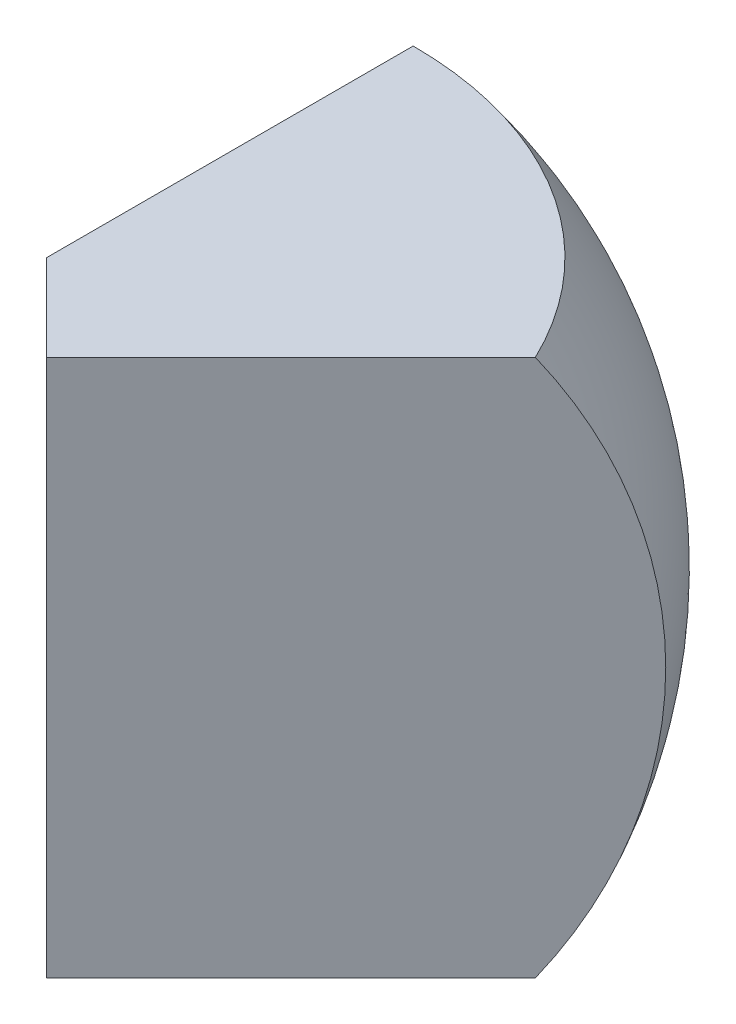
ISO-10303-21;
HEADER;
FILE_DESCRIPTION(('STEP AP214'),'2;1');
FILE_NAME('part.step','',(''),(''),'','','');
FILE_SCHEMA(('AUTOMOTIVE_DESIGN { 1 0 10303 214 1 1 1 1 }'));
ENDSEC;
DATA;
#1=APPLICATION_CONTEXT('core data for automotive mechanical design processes');
#2=APPLICATION_PROTOCOL_DEFINITION('international standard','automotive_design',2000,#1);
#3=PRODUCT_CONTEXT('',#1,'mechanical');
#4=PRODUCT('Part','Part','',(#3));
#5=PRODUCT_RELATED_PRODUCT_CATEGORY('part','',(#4));
#6=PRODUCT_DEFINITION_FORMATION('','',#4);
#7=PRODUCT_DEFINITION_CONTEXT('part definition',#1,'design');
#8=PRODUCT_DEFINITION('design','',#6,#7);
#9=PRODUCT_DEFINITION_SHAPE('','',#8);
#10=(LENGTH_UNIT() NAMED_UNIT(*) SI_UNIT(.MILLI.,.METRE.));
#11=(NAMED_UNIT(*) PLANE_ANGLE_UNIT() SI_UNIT($,.RADIAN.));
#12=(NAMED_UNIT(*) SI_UNIT($,.STERADIAN.) SOLID_ANGLE_UNIT());
#13=UNCERTAINTY_MEASURE_WITH_UNIT(LENGTH_MEASURE(1.E-05),#10,'distance_accuracy_value','');
#14=(GEOMETRIC_REPRESENTATION_CONTEXT(3) GLOBAL_UNCERTAINTY_ASSIGNED_CONTEXT((#13)) GLOBAL_UNIT_ASSIGNED_CONTEXT((#10,
#11,#12)) REPRESENTATION_CONTEXT('',''));
#15=CARTESIAN_POINT('',(0.,0.,0.));
#16=DIRECTION('',(0.,0.,1.));
#17=DIRECTION('',(1.,0.,0.));
#18=AXIS2_PLACEMENT_3D('',#15,#16,#17);
#19=CARTESIAN_POINT('',(0.,0.,0.));
#20=DIRECTION('',(-1.,0.,0.));
#21=DIRECTION('',(0.,0.,1.));
#22=AXIS2_PLACEMENT_3D('',#19,#20,#21);
#23=PLANE('',#22);
#24=DIRECTION('',(0.,-1.,0.));
#25=VECTOR('',#24,1.);
#26=CARTESIAN_POINT('',(0.,55.,0.));
#27=LINE('',#26,#25);
#28=CARTESIAN_POINT('',(0.,55.,0.));
#29=VERTEX_POINT('',#28);
#30=CARTESIAN_POINT('',(0.,-55.,0.));
#31=VERTEX_POINT('',#30);
#32=EDGE_CURVE('E85',#29,#31,#27,.T.);
#33=ORIENTED_EDGE('',*,*,#32,.F.);
#34=DIRECTION('',(0.,0.,-1.));
#35=VECTOR('',#34,1.);
#36=CARTESIAN_POINT('',(0.,55.,0.));
#37=LINE('',#36,#35);
#38=CARTESIAN_POINT('',(-5.2372220082647E-13,55.,-75.));
#39=VERTEX_POINT('',#38);
#40=EDGE_CURVE('E56',#29,#39,#37,.T.);
#41=ORIENTED_EDGE('',*,*,#40,.T.);
#42=CARTESIAN_POINT('',(0.,0.,0.));
#43=DIRECTION('',(-1.,0.,0.));
#44=DIRECTION('',(0.,0.,1.));
#45=AXIS2_PLACEMENT_3D('',#42,#43,#44);
#46=CIRCLE('',#45,93.0053761886914);
#47=CARTESIAN_POINT('',(-5.2372220082647E-13,-55.,-75.));
#48=VERTEX_POINT('',#47);
#49=EDGE_CURVE('E103',#39,#48,#46,.T.);
#50=ORIENTED_EDGE('',*,*,#49,.T.);
#51=DIRECTION('',(0.,0.,-1.));
#52=VECTOR('',#51,1.);
#53=CARTESIAN_POINT('',(0.,-55.,0.));
#54=LINE('',#53,#52);
#55=EDGE_CURVE('E48',#31,#48,#54,.T.);
#56=ORIENTED_EDGE('',*,*,#55,.F.);
#57=EDGE_LOOP('',(#33,#41,#50,#56));
#58=FACE_BOUND('',#57,.T.);
#59=ADVANCED_FACE('F33',(#58),#23,.T.);
#60=CARTESIAN_POINT('',(0.,55.,0.));
#61=DIRECTION('',(0.,-1.,0.));
#62=DIRECTION('',(0.,0.,-1.));
#63=AXIS2_PLACEMENT_3D('',#60,#61,#62);
#64=PLANE('',#63);
#65=ORIENTED_EDGE('',*,*,#40,.F.);
#66=DIRECTION('',(0.707106781186549,0.,0.707106781186546));
#67=VECTOR('',#66,1.);
#68=CARTESIAN_POINT('',(0.,55.,0.));
#69=LINE('',#68,#67);
#70=CARTESIAN_POINT('',(17.6776695296637,55.,17.6776695296637));
#71=VERTEX_POINT('',#70);
#72=EDGE_CURVE('E81',#29,#71,#69,.T.);
#73=ORIENTED_EDGE('',*,*,#72,.T.);
#74=DIRECTION('',(0.707106781186545,0.,-0.70710678118655));
#75=VECTOR('',#74,1.);
#76=CARTESIAN_POINT('',(17.6776695296637,55.,17.6776695296636));
#77=LINE('',#76,#75);
#78=CARTESIAN_POINT('',(67.6776695296636,55.,-32.3223304703365));
#79=VERTEX_POINT('',#78);
#80=EDGE_CURVE('E86',#71,#79,#77,.T.);
#81=ORIENTED_EDGE('',*,*,#80,.T.);
#82=CARTESIAN_POINT('',(0.,55.,0.));
#83=DIRECTION('',(0.,-1.,0.));
#84=DIRECTION('',(0.,0.,-1.));
#85=AXIS2_PLACEMENT_3D('',#82,#83,#84);
#86=CIRCLE('',#85,75.);
#87=EDGE_CURVE('E11',#39,#79,#86,.T.);
#88=ORIENTED_EDGE('',*,*,#87,.F.);
#89=EDGE_LOOP('',(#65,#73,#81,#88));
#90=FACE_BOUND('',#89,.T.);
#91=ADVANCED_FACE('F94',(#90),#64,.F.);
#92=CARTESIAN_POINT('',(0.,0.,0.));
#93=DIRECTION('',(0.,-1.,0.));
#94=DIRECTION('',(0.,0.,-1.));
#95=AXIS2_PLACEMENT_3D('',#92,#93,#94);
#96=SPHERICAL_SURFACE('',#95,93.0053761886914);
#97=ORIENTED_EDGE('',*,*,#87,.T.);
#98=CARTESIAN_POINT('',(17.6776695296637,0.,17.6776695296636));
#99=DIRECTION('',(-0.70710678118655,0.,-0.707106781186545));
#100=DIRECTION('',(-0.707106781186545,0.,0.70710678118655));
#101=AXIS2_PLACEMENT_3D('',#98,#99,#100);
#102=CIRCLE('',#101,89.5823643358446);
#103=CARTESIAN_POINT('',(67.6776695296636,-55.,-32.3223304703365));
#104=VERTEX_POINT('',#103);
#105=EDGE_CURVE('E91',#79,#104,#102,.T.);
#106=ORIENTED_EDGE('',*,*,#105,.T.);
#107=CARTESIAN_POINT('',(0.,-55.,0.));
#108=DIRECTION('',(0.,-1.,0.));
#109=DIRECTION('',(0.,0.,-1.));
#110=AXIS2_PLACEMENT_3D('',#107,#108,#109);
#111=CIRCLE('',#110,75.);
#112=EDGE_CURVE('E41',#48,#104,#111,.T.);
#113=ORIENTED_EDGE('',*,*,#112,.F.);
#114=ORIENTED_EDGE('',*,*,#49,.F.);
#115=EDGE_LOOP('',(#97,#106,#113,#114));
#116=FACE_BOUND('',#115,.T.);
#117=ADVANCED_FACE('F35',(#116),#96,.T.);
#118=CARTESIAN_POINT('',(0.,-55.,0.));
#119=DIRECTION('',(0.,-1.,0.));
#120=DIRECTION('',(0.,0.,-1.));
#121=AXIS2_PLACEMENT_3D('',#118,#119,#120);
#122=PLANE('',#121);
#123=DIRECTION('',(0.707106781186549,0.,0.707106781186546));
#124=VECTOR('',#123,1.);
#125=CARTESIAN_POINT('',(0.,-55.,0.));
#126=LINE('',#125,#124);
#127=CARTESIAN_POINT('',(17.6776695296637,-55.,17.6776695296637));
#128=VERTEX_POINT('',#127);
#129=EDGE_CURVE('E82',#31,#128,#126,.T.);
#130=ORIENTED_EDGE('',*,*,#129,.F.);
#131=ORIENTED_EDGE('',*,*,#55,.T.);
#132=ORIENTED_EDGE('',*,*,#112,.T.);
#133=DIRECTION('',(0.707106781186545,0.,-0.70710678118655));
#134=VECTOR('',#133,1.);
#135=CARTESIAN_POINT('',(17.6776695296637,-55.,17.6776695296636));
#136=LINE('',#135,#134);
#137=EDGE_CURVE('E95',#128,#104,#136,.T.);
#138=ORIENTED_EDGE('',*,*,#137,.F.);
#139=EDGE_LOOP('',(#130,#131,#132,#138));
#140=FACE_BOUND('',#139,.T.);
#141=ADVANCED_FACE('F105',(#140),#122,.T.);
#142=CARTESIAN_POINT('',(17.6776695296637,55.,17.6776695296636));
#143=DIRECTION('',(-0.70710678118655,0.,-0.707106781186545));
#144=DIRECTION('',(-0.707106781186545,0.,0.70710678118655));
#145=AXIS2_PLACEMENT_3D('',#142,#143,#144);
#146=PLANE('',#145);
#147=ORIENTED_EDGE('',*,*,#105,.F.);
#148=ORIENTED_EDGE('',*,*,#80,.F.);
#149=DIRECTION('',(0.,-1.,0.));
#150=VECTOR('',#149,1.);
#151=CARTESIAN_POINT('',(17.6776695296637,55.,17.6776695296637));
#152=LINE('',#151,#150);
#153=EDGE_CURVE('E77',#71,#128,#152,.T.);
#154=ORIENTED_EDGE('',*,*,#153,.T.);
#155=ORIENTED_EDGE('',*,*,#137,.T.);
#156=EDGE_LOOP('',(#147,#148,#154,#155));
#157=FACE_BOUND('',#156,.T.);
#158=ADVANCED_FACE('F89',(#157),#146,.F.);
#159=CARTESIAN_POINT('',(0.,55.,0.));
#160=DIRECTION('',(0.707106781186546,0.,-0.707106781186549));
#161=DIRECTION('',(-0.707106781186549,0.,-0.707106781186546));
#162=AXIS2_PLACEMENT_3D('',#159,#160,#161);
#163=PLANE('',#162);
#164=ORIENTED_EDGE('',*,*,#129,.T.);
#165=ORIENTED_EDGE('',*,*,#153,.F.);
#166=ORIENTED_EDGE('',*,*,#72,.F.);
#167=ORIENTED_EDGE('',*,*,#32,.T.);
#168=EDGE_LOOP('',(#164,#165,#166,#167));
#169=FACE_BOUND('',#168,.T.);
#170=ADVANCED_FACE('F79',(#169),#163,.F.);
#171=CLOSED_SHELL('',(#59,#91,#117,#141,#158,#170));
#172=MANIFOLD_SOLID_BREP('B2',#171);
#173=ADVANCED_BREP_SHAPE_REPRESENTATION('',(#18,#172),#14);
#174=SHAPE_DEFINITION_REPRESENTATION(#9,#173);
ENDSEC;
END-ISO-10303-21;
